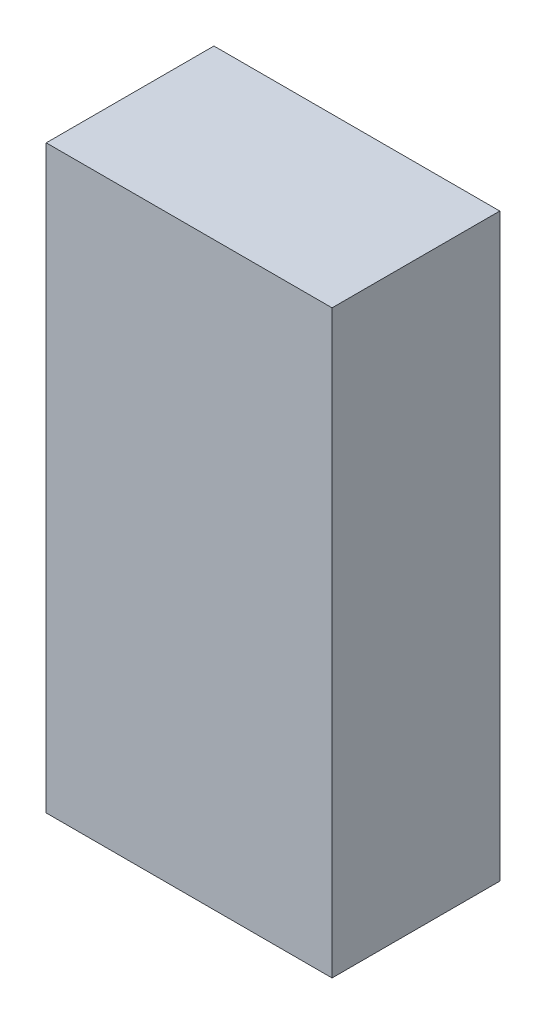
ISO-10303-21;
HEADER;
FILE_DESCRIPTION(('STEP AP214'),'2;1');
FILE_NAME('part.step','',(''),(''),'','','');
FILE_SCHEMA(('AUTOMOTIVE_DESIGN { 1 0 10303 214 1 1 1 1 }'));
ENDSEC;
DATA;
#1=APPLICATION_CONTEXT('core data for automotive mechanical design processes');
#2=APPLICATION_PROTOCOL_DEFINITION('international standard','automotive_design',2000,#1);
#3=PRODUCT_CONTEXT('',#1,'mechanical');
#4=PRODUCT('Part','Part','',(#3));
#5=PRODUCT_RELATED_PRODUCT_CATEGORY('part','',(#4));
#6=PRODUCT_DEFINITION_FORMATION('','',#4);
#7=PRODUCT_DEFINITION_CONTEXT('part definition',#1,'design');
#8=PRODUCT_DEFINITION('design','',#6,#7);
#9=PRODUCT_DEFINITION_SHAPE('','',#8);
#10=(LENGTH_UNIT() NAMED_UNIT(*) SI_UNIT(.MILLI.,.METRE.));
#11=(NAMED_UNIT(*) PLANE_ANGLE_UNIT() SI_UNIT($,.RADIAN.));
#12=(NAMED_UNIT(*) SI_UNIT($,.STERADIAN.) SOLID_ANGLE_UNIT());
#13=UNCERTAINTY_MEASURE_WITH_UNIT(LENGTH_MEASURE(1.E-05),#10,'distance_accuracy_value','');
#14=(GEOMETRIC_REPRESENTATION_CONTEXT(3) GLOBAL_UNCERTAINTY_ASSIGNED_CONTEXT((#13)) GLOBAL_UNIT_ASSIGNED_CONTEXT((#10,
#11,#12)) REPRESENTATION_CONTEXT('',''));
#15=CARTESIAN_POINT('',(0.,0.,0.));
#16=DIRECTION('',(0.,0.,1.));
#17=DIRECTION('',(1.,0.,0.));
#18=AXIS2_PLACEMENT_3D('',#15,#16,#17);
#19=CARTESIAN_POINT('',(80.,-9.95,46.75));
#20=DIRECTION('',(0.,0.,1.));
#21=DIRECTION('',(1.,0.,0.));
#22=AXIS2_PLACEMENT_3D('',#19,#20,#21);
#23=PLANE('',#22);
#24=DIRECTION('',(0.,1.,0.));
#25=VECTOR('',#24,1.);
#26=CARTESIAN_POINT('',(80.,-9.95,46.75));
#27=LINE('',#26,#25);
#28=CARTESIAN_POINT('',(80.,-9.95,46.75));
#29=VERTEX_POINT('',#28);
#30=CARTESIAN_POINT('',(80.,9.95,46.75));
#31=VERTEX_POINT('',#30);
#32=EDGE_CURVE('E68',#29,#31,#27,.T.);
#33=ORIENTED_EDGE('',*,*,#32,.F.);
#34=DIRECTION('',(1.,0.,0.));
#35=VECTOR('',#34,1.);
#36=CARTESIAN_POINT('',(80.,-9.95,46.75));
#37=LINE('',#36,#35);
#38=CARTESIAN_POINT('',(89.8,-9.95,46.75));
#39=VERTEX_POINT('',#38);
#40=EDGE_CURVE('E62',#29,#39,#37,.T.);
#41=ORIENTED_EDGE('',*,*,#40,.T.);
#42=DIRECTION('',(0.,1.,0.));
#43=VECTOR('',#42,1.);
#44=CARTESIAN_POINT('',(89.8,-9.95,46.75));
#45=LINE('',#44,#43);
#46=CARTESIAN_POINT('',(89.8,9.95,46.75));
#47=VERTEX_POINT('',#46);
#48=EDGE_CURVE('E64',#39,#47,#45,.T.);
#49=ORIENTED_EDGE('',*,*,#48,.T.);
#50=DIRECTION('',(1.,0.,0.));
#51=VECTOR('',#50,1.);
#52=CARTESIAN_POINT('',(80.,9.95,46.75));
#53=LINE('',#52,#51);
#54=EDGE_CURVE('E9',#31,#47,#53,.T.);
#55=ORIENTED_EDGE('',*,*,#54,.F.);
#56=EDGE_LOOP('',(#33,#41,#49,#55));
#57=FACE_BOUND('',#56,.T.);
#58=ADVANCED_FACE('F14',(#57),#23,.T.);
#59=CARTESIAN_POINT('',(80.,-9.95,41.));
#60=DIRECTION('',(0.,0.,1.));
#61=DIRECTION('',(1.,0.,0.));
#62=AXIS2_PLACEMENT_3D('',#59,#60,#61);
#63=PLANE('',#62);
#64=DIRECTION('',(1.,0.,0.));
#65=VECTOR('',#64,1.);
#66=CARTESIAN_POINT('',(80.,9.95,41.));
#67=LINE('',#66,#65);
#68=CARTESIAN_POINT('',(80.,9.95,41.));
#69=VERTEX_POINT('',#68);
#70=CARTESIAN_POINT('',(89.8,9.95,41.));
#71=VERTEX_POINT('',#70);
#72=EDGE_CURVE('E24',#69,#71,#67,.T.);
#73=ORIENTED_EDGE('',*,*,#72,.T.);
#74=DIRECTION('',(0.,1.,0.));
#75=VECTOR('',#74,1.);
#76=CARTESIAN_POINT('',(89.8,-9.95,41.));
#77=LINE('',#76,#75);
#78=CARTESIAN_POINT('',(89.8,-9.95,41.));
#79=VERTEX_POINT('',#78);
#80=EDGE_CURVE('E82',#79,#71,#77,.T.);
#81=ORIENTED_EDGE('',*,*,#80,.F.);
#82=DIRECTION('',(1.,0.,0.));
#83=VECTOR('',#82,1.);
#84=CARTESIAN_POINT('',(80.,-9.95,41.));
#85=LINE('',#84,#83);
#86=CARTESIAN_POINT('',(80.,-9.95,41.));
#87=VERTEX_POINT('',#86);
#88=EDGE_CURVE('E54',#87,#79,#85,.T.);
#89=ORIENTED_EDGE('',*,*,#88,.F.);
#90=DIRECTION('',(0.,1.,0.));
#91=VECTOR('',#90,1.);
#92=CARTESIAN_POINT('',(80.,-9.95,41.));
#93=LINE('',#92,#91);
#94=EDGE_CURVE('E91',#87,#69,#93,.T.);
#95=ORIENTED_EDGE('',*,*,#94,.T.);
#96=EDGE_LOOP('',(#73,#81,#89,#95));
#97=FACE_BOUND('',#96,.T.);
#98=ADVANCED_FACE('F111',(#97),#63,.F.);
#99=CARTESIAN_POINT('',(80.,9.95,41.));
#100=DIRECTION('',(0.,1.,0.));
#101=DIRECTION('',(1.,0.,0.));
#102=AXIS2_PLACEMENT_3D('',#99,#100,#101);
#103=PLANE('',#102);
#104=ORIENTED_EDGE('',*,*,#72,.F.);
#105=DIRECTION('',(0.,0.,1.));
#106=VECTOR('',#105,1.);
#107=CARTESIAN_POINT('',(80.,9.95,41.));
#108=LINE('',#107,#106);
#109=EDGE_CURVE('E95',#69,#31,#108,.T.);
#110=ORIENTED_EDGE('',*,*,#109,.T.);
#111=ORIENTED_EDGE('',*,*,#54,.T.);
#112=DIRECTION('',(0.,0.,1.));
#113=VECTOR('',#112,1.);
#114=CARTESIAN_POINT('',(89.8,9.95,41.));
#115=LINE('',#114,#113);
#116=EDGE_CURVE('E77',#71,#47,#115,.T.);
#117=ORIENTED_EDGE('',*,*,#116,.F.);
#118=EDGE_LOOP('',(#104,#110,#111,#117));
#119=FACE_BOUND('',#118,.T.);
#120=ADVANCED_FACE('F113',(#119),#103,.T.);
#121=CARTESIAN_POINT('',(80.,-9.95,41.));
#122=DIRECTION('',(0.,1.,0.));
#123=DIRECTION('',(1.,0.,0.));
#124=AXIS2_PLACEMENT_3D('',#121,#122,#123);
#125=PLANE('',#124);
#126=DIRECTION('',(0.,0.,1.));
#127=VECTOR('',#126,1.);
#128=CARTESIAN_POINT('',(89.8,-9.95,41.));
#129=LINE('',#128,#127);
#130=EDGE_CURVE('E76',#79,#39,#129,.T.);
#131=ORIENTED_EDGE('',*,*,#130,.T.);
#132=ORIENTED_EDGE('',*,*,#40,.F.);
#133=DIRECTION('',(0.,0.,1.));
#134=VECTOR('',#133,1.);
#135=CARTESIAN_POINT('',(80.,-9.95,41.));
#136=LINE('',#135,#134);
#137=EDGE_CURVE('E83',#87,#29,#136,.T.);
#138=ORIENTED_EDGE('',*,*,#137,.F.);
#139=ORIENTED_EDGE('',*,*,#88,.T.);
#140=EDGE_LOOP('',(#131,#132,#138,#139));
#141=FACE_BOUND('',#140,.T.);
#142=ADVANCED_FACE('F80',(#141),#125,.F.);
#143=CARTESIAN_POINT('',(89.8,-9.95,41.));
#144=DIRECTION('',(1.,0.,0.));
#145=DIRECTION('',(0.,1.,0.));
#146=AXIS2_PLACEMENT_3D('',#143,#144,#145);
#147=PLANE('',#146);
#148=ORIENTED_EDGE('',*,*,#130,.F.);
#149=ORIENTED_EDGE('',*,*,#80,.T.);
#150=ORIENTED_EDGE('',*,*,#116,.T.);
#151=ORIENTED_EDGE('',*,*,#48,.F.);
#152=EDGE_LOOP('',(#148,#149,#150,#151));
#153=FACE_BOUND('',#152,.T.);
#154=ADVANCED_FACE('F74',(#153),#147,.T.);
#155=CARTESIAN_POINT('',(80.,-9.95,41.));
#156=DIRECTION('',(1.,0.,0.));
#157=DIRECTION('',(0.,1.,0.));
#158=AXIS2_PLACEMENT_3D('',#155,#156,#157);
#159=PLANE('',#158);
#160=ORIENTED_EDGE('',*,*,#32,.T.);
#161=ORIENTED_EDGE('',*,*,#109,.F.);
#162=ORIENTED_EDGE('',*,*,#94,.F.);
#163=ORIENTED_EDGE('',*,*,#137,.T.);
#164=EDGE_LOOP('',(#160,#161,#162,#163));
#165=FACE_BOUND('',#164,.T.);
#166=ADVANCED_FACE('F16',(#165),#159,.F.);
#167=CLOSED_SHELL('',(#58,#98,#120,#142,#154,#166));
#168=MANIFOLD_SOLID_BREP('B1',#167);
#169=ADVANCED_BREP_SHAPE_REPRESENTATION('',(#18,#168),#14);
#170=SHAPE_DEFINITION_REPRESENTATION(#9,#169);
ENDSEC;
END-ISO-10303-21;
